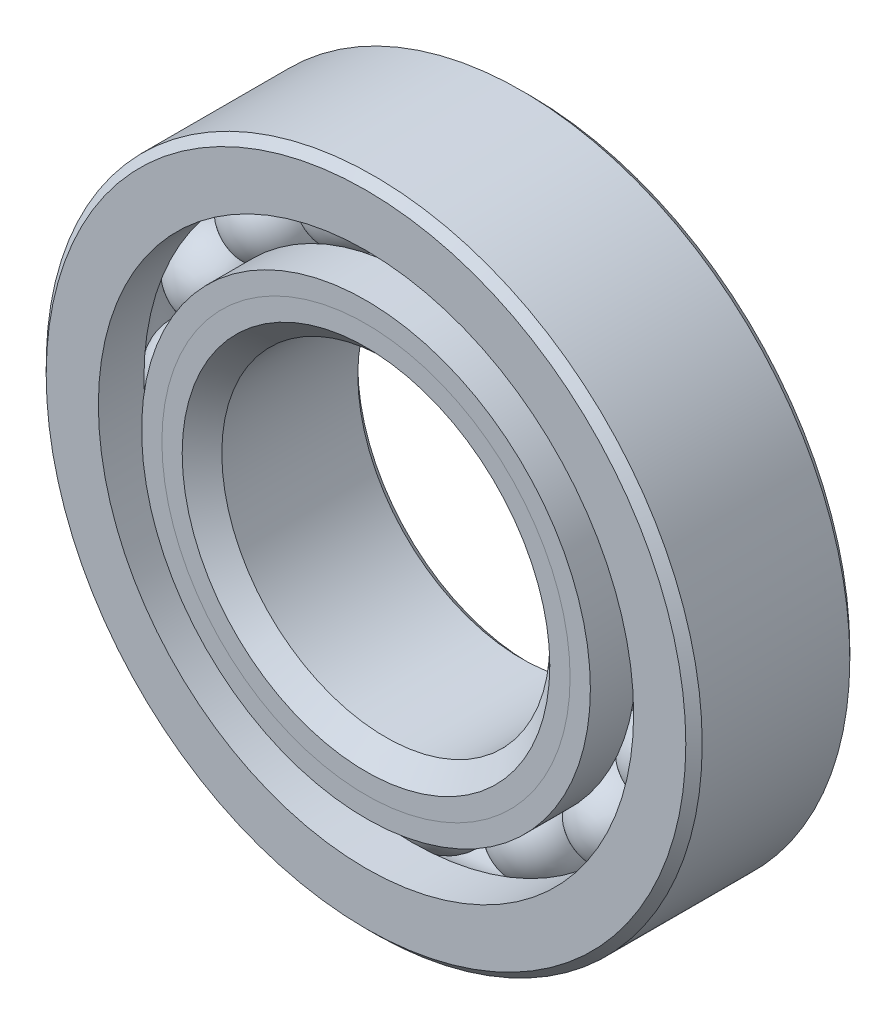
ISO-10303-21;
HEADER;
FILE_DESCRIPTION(('STEP AP214'),'2;1');
FILE_NAME('part.step','',(''),(''),'','','');
FILE_SCHEMA(('AUTOMOTIVE_DESIGN { 1 0 10303 214 1 1 1 1 }'));
ENDSEC;
DATA;
#1=APPLICATION_CONTEXT('core data for automotive mechanical design processes');
#2=APPLICATION_PROTOCOL_DEFINITION('international standard','automotive_design',2000,#1);
#3=PRODUCT_CONTEXT('',#1,'mechanical');
#4=PRODUCT('Part','Part','',(#3));
#5=PRODUCT_RELATED_PRODUCT_CATEGORY('part','',(#4));
#6=PRODUCT_DEFINITION_FORMATION('','',#4);
#7=PRODUCT_DEFINITION_CONTEXT('part definition',#1,'design');
#8=PRODUCT_DEFINITION('design','',#6,#7);
#9=PRODUCT_DEFINITION_SHAPE('','',#8);
#10=(LENGTH_UNIT() NAMED_UNIT(*) SI_UNIT(.MILLI.,.METRE.));
#11=(NAMED_UNIT(*) PLANE_ANGLE_UNIT() SI_UNIT($,.RADIAN.));
#12=(NAMED_UNIT(*) SI_UNIT($,.STERADIAN.) SOLID_ANGLE_UNIT());
#13=UNCERTAINTY_MEASURE_WITH_UNIT(LENGTH_MEASURE(1.E-05),#10,'distance_accuracy_value','');
#14=(GEOMETRIC_REPRESENTATION_CONTEXT(3) GLOBAL_UNCERTAINTY_ASSIGNED_CONTEXT((#13)) GLOBAL_UNIT_ASSIGNED_CONTEXT((#10,
#11,#12)) REPRESENTATION_CONTEXT('',''));
#15=CARTESIAN_POINT('',(0.,0.,0.));
#16=DIRECTION('',(0.,0.,1.));
#17=DIRECTION('',(1.,0.,0.));
#18=AXIS2_PLACEMENT_3D('',#15,#16,#17);
#19=CARTESIAN_POINT('',(-7.29011938655472,17.5999050943401,0.));
#20=DIRECTION('',(0.,0.,1.));
#21=DIRECTION('',(-0.382683432365077,0.923879532511292,0.));
#22=AXIS2_PLACEMENT_3D('',#19,#20,#21);
#23=SPHERICAL_SURFACE('',#22,3.28171342706955);
#24=CARTESIAN_POINT('',(-7.29011938655472,17.5999050943401,3.28171342706955));
#25=VERTEX_POINT('',#24);
#26=VERTEX_LOOP('',#25);
#27=FACE_BOUND('',#26,.T.);
#28=ADVANCED_FACE('F39',(#27),#23,.T.);
#29=CLOSED_SHELL('',(#28));
#30=MANIFOLD_SOLID_BREP('B2',#29);
#31=CARTESIAN_POINT('',(-13.4703841816036,13.4703841816039,0.));
#32=DIRECTION('',(0.,0.,1.));
#33=DIRECTION('',(-0.707106781186539,0.707106781186556,0.));
#34=AXIS2_PLACEMENT_3D('',#31,#32,#33);
#35=SPHERICAL_SURFACE('',#34,3.28171342706955);
#36=CARTESIAN_POINT('',(-13.4703841816036,13.4703841816039,3.28171342706955));
#37=VERTEX_POINT('',#36);
#38=VERTEX_LOOP('',#37);
#39=FACE_BOUND('',#38,.T.);
#40=ADVANCED_FACE('F60',(#39),#35,.T.);
#41=CLOSED_SHELL('',(#40));
#42=MANIFOLD_SOLID_BREP('B6',#41);
#43=CARTESIAN_POINT('',(-17.5999050943399,7.29011938655515,0.));
#44=DIRECTION('',(0.,0.,1.));
#45=DIRECTION('',(-0.923879532511283,0.3826834323651,0.));
#46=AXIS2_PLACEMENT_3D('',#43,#44,#45);
#47=SPHERICAL_SURFACE('',#46,3.28171342706955);
#48=CARTESIAN_POINT('',(-17.5999050943399,7.29011938655515,3.28171342706955));
#49=VERTEX_POINT('',#48);
#50=VERTEX_LOOP('',#49);
#51=FACE_BOUND('',#50,.T.);
#52=ADVANCED_FACE('F81',(#51),#47,.T.);
#53=CLOSED_SHELL('',(#52));
#54=MANIFOLD_SOLID_BREP('B35',#53);
#55=CARTESIAN_POINT('',(-19.05,1.99538274087401E-13,0.));
#56=DIRECTION('',(0.,0.,1.));
#57=DIRECTION('',(-1.,0.,0.));
#58=AXIS2_PLACEMENT_3D('',#55,#56,#57);
#59=SPHERICAL_SURFACE('',#58,3.28171342706955);
#60=CARTESIAN_POINT('',(-19.05,1.99538274087401E-13,3.28171342706955));
#61=VERTEX_POINT('',#60);
#62=VERTEX_LOOP('',#61);
#63=FACE_BOUND('',#62,.T.);
#64=ADVANCED_FACE('F102',(#63),#59,.T.);
#65=CLOSED_SHELL('',(#64));
#66=MANIFOLD_SOLID_BREP('B56',#65);
#67=CARTESIAN_POINT('',(-17.5999050943401,-7.29011938655478,0.));
#68=DIRECTION('',(0.,0.,1.));
#69=DIRECTION('',(-0.923879532511291,-0.382683432365081,0.));
#70=AXIS2_PLACEMENT_3D('',#67,#68,#69);
#71=SPHERICAL_SURFACE('',#70,3.28171342706955);
#72=CARTESIAN_POINT('',(-17.5999050943401,-7.29011938655478,3.28171342706955));
#73=VERTEX_POINT('',#72);
#74=VERTEX_LOOP('',#73);
#75=FACE_BOUND('',#74,.T.);
#76=ADVANCED_FACE('F123',(#75),#71,.T.);
#77=CLOSED_SHELL('',(#76));
#78=MANIFOLD_SOLID_BREP('B77',#77);
#79=CARTESIAN_POINT('',(-13.4703841816038,-13.4703841816036,0.));
#80=DIRECTION('',(0.,0.,1.));
#81=DIRECTION('',(-0.707106781186554,-0.707106781186541,0.));
#82=AXIS2_PLACEMENT_3D('',#79,#80,#81);
#83=SPHERICAL_SURFACE('',#82,3.28171342706955);
#84=CARTESIAN_POINT('',(-13.4703841816038,-13.4703841816036,3.28171342706955));
#85=VERTEX_POINT('',#84);
#86=VERTEX_LOOP('',#85);
#87=FACE_BOUND('',#86,.T.);
#88=ADVANCED_FACE('F144',(#87),#83,.T.);
#89=CLOSED_SHELL('',(#88));
#90=MANIFOLD_SOLID_BREP('B98',#89);
#91=CARTESIAN_POINT('',(-7.2901193865551,-17.59990509434,0.));
#92=DIRECTION('',(0.,0.,1.));
#93=DIRECTION('',(-0.382683432365097,-0.923879532511284,0.));
#94=AXIS2_PLACEMENT_3D('',#91,#92,#93);
#95=SPHERICAL_SURFACE('',#94,3.28171342706955);
#96=CARTESIAN_POINT('',(-7.2901193865551,-17.59990509434,3.28171342706955));
#97=VERTEX_POINT('',#96);
#98=VERTEX_LOOP('',#97);
#99=FACE_BOUND('',#98,.T.);
#100=ADVANCED_FACE('F165',(#99),#95,.T.);
#101=CLOSED_SHELL('',(#100));
#102=MANIFOLD_SOLID_BREP('B119',#101);
#103=CARTESIAN_POINT('',(-1.33025516058267E-13,-19.05,0.));
#104=DIRECTION('',(0.,0.,1.));
#105=DIRECTION('',(0.,-1.,0.));
#106=AXIS2_PLACEMENT_3D('',#103,#104,#105);
#107=SPHERICAL_SURFACE('',#106,3.28171342706955);
#108=CARTESIAN_POINT('',(-1.33025516058267E-13,-19.05,3.28171342706955));
#109=VERTEX_POINT('',#108);
#110=VERTEX_LOOP('',#109);
#111=FACE_BOUND('',#110,.T.);
#112=ADVANCED_FACE('F186',(#111),#107,.T.);
#113=CLOSED_SHELL('',(#112));
#114=MANIFOLD_SOLID_BREP('B140',#113);
#115=CARTESIAN_POINT('',(7.29011938655485,-17.5999050943401,0.));
#116=DIRECTION('',(0.,0.,1.));
#117=DIRECTION('',(0.382683432365084,-0.923879532511289,0.));
#118=AXIS2_PLACEMENT_3D('',#115,#116,#117);
#119=SPHERICAL_SURFACE('',#118,3.28171342706955);
#120=CARTESIAN_POINT('',(7.29011938655485,-17.5999050943401,3.28171342706955));
#121=VERTEX_POINT('',#120);
#122=VERTEX_LOOP('',#121);
#123=FACE_BOUND('',#122,.T.);
#124=ADVANCED_FACE('F207',(#123),#119,.T.);
#125=CLOSED_SHELL('',(#124));
#126=MANIFOLD_SOLID_BREP('B161',#125);
#127=CARTESIAN_POINT('',(13.4703841816037,-13.4703841816038,0.));
#128=DIRECTION('',(0.,0.,1.));
#129=DIRECTION('',(0.707106781186544,-0.707106781186551,0.));
#130=AXIS2_PLACEMENT_3D('',#127,#128,#129);
#131=SPHERICAL_SURFACE('',#130,3.28171342706955);
#132=CARTESIAN_POINT('',(13.4703841816037,-13.4703841816038,3.28171342706955));
#133=VERTEX_POINT('',#132);
#134=VERTEX_LOOP('',#133);
#135=FACE_BOUND('',#134,.T.);
#136=ADVANCED_FACE('F228',(#135),#131,.T.);
#137=CLOSED_SHELL('',(#136));
#138=MANIFOLD_SOLID_BREP('B182',#137);
#139=CARTESIAN_POINT('',(17.59990509434,-7.29011938655504,0.));
#140=DIRECTION('',(0.,0.,1.));
#141=DIRECTION('',(0.923879532511285,-0.382683432365094,0.));
#142=AXIS2_PLACEMENT_3D('',#139,#140,#141);
#143=SPHERICAL_SURFACE('',#142,3.28171342706955);
#144=CARTESIAN_POINT('',(17.59990509434,-7.29011938655504,3.28171342706955));
#145=VERTEX_POINT('',#144);
#146=VERTEX_LOOP('',#145);
#147=FACE_BOUND('',#146,.T.);
#148=ADVANCED_FACE('F249',(#147),#143,.T.);
#149=CLOSED_SHELL('',(#148));
#150=MANIFOLD_SOLID_BREP('B203',#149);
#151=CARTESIAN_POINT('',(19.05,0.,0.));
#152=DIRECTION('',(0.,0.,1.));
#153=DIRECTION('',(1.,0.,0.));
#154=AXIS2_PLACEMENT_3D('',#151,#152,#153);
#155=SPHERICAL_SURFACE('',#154,3.28171342706955);
#156=CARTESIAN_POINT('',(19.05,0.,3.28171342706955));
#157=VERTEX_POINT('',#156);
#158=VERTEX_LOOP('',#157);
#159=FACE_BOUND('',#158,.T.);
#160=ADVANCED_FACE('F270',(#159),#155,.T.);
#161=CLOSED_SHELL('',(#160));
#162=MANIFOLD_SOLID_BREP('B224',#161);
#163=CARTESIAN_POINT('',(17.59990509434,7.29011938655491,0.));
#164=DIRECTION('',(0.,0.,1.));
#165=DIRECTION('',(0.923879532511288,0.382683432365087,0.));
#166=AXIS2_PLACEMENT_3D('',#163,#164,#165);
#167=SPHERICAL_SURFACE('',#166,3.28171342706955);
#168=CARTESIAN_POINT('',(17.59990509434,7.29011938655491,3.28171342706955));
#169=VERTEX_POINT('',#168);
#170=VERTEX_LOOP('',#169);
#171=FACE_BOUND('',#170,.T.);
#172=ADVANCED_FACE('F291',(#171),#167,.T.);
#173=CLOSED_SHELL('',(#172));
#174=MANIFOLD_SOLID_BREP('B245',#173);
#175=CARTESIAN_POINT('',(13.4703841816038,13.4703841816037,0.));
#176=DIRECTION('',(0.,0.,1.));
#177=DIRECTION('',(0.707106781186549,0.707106781186546,0.));
#178=AXIS2_PLACEMENT_3D('',#175,#176,#177);
#179=SPHERICAL_SURFACE('',#178,3.28171342706955);
#180=CARTESIAN_POINT('',(13.4703841816038,13.4703841816037,3.28171342706955));
#181=VERTEX_POINT('',#180);
#182=VERTEX_LOOP('',#181);
#183=FACE_BOUND('',#182,.T.);
#184=ADVANCED_FACE('F312',(#183),#179,.T.);
#185=CLOSED_SHELL('',(#184));
#186=MANIFOLD_SOLID_BREP('B266',#185);
#187=CARTESIAN_POINT('',(7.29011938655498,17.59990509434,0.));
#188=DIRECTION('',(0.,0.,1.));
#189=DIRECTION('',(0.382683432365091,0.923879532511287,0.));
#190=AXIS2_PLACEMENT_3D('',#187,#188,#189);
#191=SPHERICAL_SURFACE('',#190,3.28171342706955);
#192=CARTESIAN_POINT('',(7.29011938655498,17.59990509434,3.28171342706955));
#193=VERTEX_POINT('',#192);
#194=VERTEX_LOOP('',#193);
#195=FACE_BOUND('',#194,.T.);
#196=ADVANCED_FACE('F333',(#195),#191,.T.);
#197=CLOSED_SHELL('',(#196));
#198=MANIFOLD_SOLID_BREP('B287',#197);
#199=CARTESIAN_POINT('',(0.,19.05,0.));
#200=DIRECTION('',(0.,0.,1.));
#201=DIRECTION('',(0.,1.,0.));
#202=AXIS2_PLACEMENT_3D('',#199,#200,#201);
#203=SPHERICAL_SURFACE('',#202,3.28171342706955);
#204=CARTESIAN_POINT('',(0.,19.05,3.28171342706955));
#205=VERTEX_POINT('',#204);
#206=VERTEX_LOOP('',#205);
#207=FACE_BOUND('',#206,.T.);
#208=ADVANCED_FACE('F355',(#207),#203,.T.);
#209=CLOSED_SHELL('',(#208));
#210=MANIFOLD_SOLID_BREP('B308',#209);
#211=CARTESIAN_POINT('',(0.,15.80470900587,6.35));
#212=DIRECTION('',(0.,0.,-1.));
#213=DIRECTION('',(-1.,0.,0.));
#214=AXIS2_PLACEMENT_3D('',#211,#212,#213);
#215=PLANE('',#214);
#216=CARTESIAN_POINT('',(0.,0.,6.35));
#217=DIRECTION('',(0.,0.,1.));
#218=DIRECTION('',(1.,0.,0.));
#219=AXIS2_PLACEMENT_3D('',#216,#217,#218);
#220=CIRCLE('',#219,14.2341432864652);
#221=CARTESIAN_POINT('',(14.2341432864652,0.,6.35));
#222=VERTEX_POINT('',#221);
#223=EDGE_CURVE('E410',#222,#222,#220,.T.);
#224=ORIENTED_EDGE('',*,*,#223,.F.);
#225=EDGE_LOOP('',(#224));
#226=FACE_BOUND('',#225,.T.);
#227=CARTESIAN_POINT('',(0.,0.,6.35));
#228=DIRECTION('',(0.,0.,1.));
#229=DIRECTION('',(1.,0.,0.));
#230=AXIS2_PLACEMENT_3D('',#227,#228,#229);
#231=CIRCLE('',#230,15.80470900587);
#232=CARTESIAN_POINT('',(15.80470900587,0.,6.35));
#233=VERTEX_POINT('',#232);
#234=EDGE_CURVE('E354',#233,#233,#231,.T.);
#235=ORIENTED_EDGE('',*,*,#234,.T.);
#236=EDGE_LOOP('',(#235));
#237=FACE_BOUND('',#236,.T.);
#238=ADVANCED_FACE('F376',(#226,#237),#215,.F.);
#239=CARTESIAN_POINT('',(0.,0.,4.77943428059525));
#240=DIRECTION('',(0.,0.,1.));
#241=DIRECTION('',(1.,0.,0.));
#242=AXIS2_PLACEMENT_3D('',#239,#240,#241);
#243=CONICAL_SURFACE('',#242,14.2341432864652,0.785398163397449);
#244=ORIENTED_EDGE('',*,*,#234,.F.);
#245=EDGE_LOOP('',(#244));
#246=FACE_BOUND('',#245,.T.);
#247=CARTESIAN_POINT('',(0.,0.,4.77943428059525));
#248=DIRECTION('',(0.,0.,1.));
#249=DIRECTION('',(1.,0.,0.));
#250=AXIS2_PLACEMENT_3D('',#247,#248,#249);
#251=CIRCLE('',#250,14.2341432864652);
#252=CARTESIAN_POINT('',(14.2341432864652,0.,4.77943428059525));
#253=VERTEX_POINT('',#252);
#254=EDGE_CURVE('E382',#253,#253,#251,.T.);
#255=ORIENTED_EDGE('',*,*,#254,.T.);
#256=EDGE_LOOP('',(#255));
#257=FACE_BOUND('',#256,.T.);
#258=ADVANCED_FACE('F417',(#246,#257),#243,.T.);
#259=CARTESIAN_POINT('',(0.,0.,6.35));
#260=DIRECTION('',(0.,0.,1.));
#261=DIRECTION('',(1.,0.,0.));
#262=AXIS2_PLACEMENT_3D('',#259,#260,#261);
#263=CYLINDRICAL_SURFACE('',#262,14.2341432864652);
#264=ORIENTED_EDGE('',*,*,#254,.F.);
#265=EDGE_LOOP('',(#264));
#266=FACE_BOUND('',#265,.T.);
#267=CARTESIAN_POINT('',(0.,0.,0.));
#268=DIRECTION('',(0.,0.,1.));
#269=DIRECTION('',(1.,0.,0.));
#270=AXIS2_PLACEMENT_3D('',#267,#268,#269);
#271=CIRCLE('',#270,14.2341432864652);
#272=CARTESIAN_POINT('',(14.2341432864652,0.,0.));
#273=VERTEX_POINT('',#272);
#274=EDGE_CURVE('E386',#273,#273,#271,.T.);
#275=ORIENTED_EDGE('',*,*,#274,.T.);
#276=EDGE_LOOP('',(#275));
#277=FACE_BOUND('',#276,.T.);
#278=ADVANCED_FACE('F421',(#266,#277),#263,.T.);
#279=CARTESIAN_POINT('',(0.,14.2341432864652,0.));
#280=DIRECTION('',(0.,0.,-1.));
#281=DIRECTION('',(-1.,0.,0.));
#282=AXIS2_PLACEMENT_3D('',#279,#280,#281);
#283=PLANE('',#282);
#284=ORIENTED_EDGE('',*,*,#274,.F.);
#285=EDGE_LOOP('',(#284));
#286=FACE_BOUND('',#285,.T.);
#287=CARTESIAN_POINT('',(0.,0.,0.));
#288=DIRECTION('',(0.,0.,1.));
#289=DIRECTION('',(1.,0.,0.));
#290=AXIS2_PLACEMENT_3D('',#287,#288,#289);
#291=CIRCLE('',#290,15.7682865729304);
#292=CARTESIAN_POINT('',(15.7682865729304,0.,0.));
#293=VERTEX_POINT('',#292);
#294=EDGE_CURVE('E390',#293,#293,#291,.T.);
#295=ORIENTED_EDGE('',*,*,#294,.T.);
#296=EDGE_LOOP('',(#295));
#297=FACE_BOUND('',#296,.T.);
#298=ADVANCED_FACE('F426',(#286,#297),#283,.F.);
#299=CARTESIAN_POINT('',(0.,0.,0.));
#300=DIRECTION('',(0.,0.,1.));
#301=DIRECTION('',(1.,0.,0.));
#302=AXIS2_PLACEMENT_3D('',#299,#300,#301);
#303=TOROIDAL_SURFACE('',#302,19.05,3.28171342706955);
#304=ORIENTED_EDGE('',*,*,#294,.F.);
#305=EDGE_LOOP('',(#304));
#306=FACE_BOUND('',#305,.T.);
#307=CARTESIAN_POINT('',(0.,0.,-2.82222222222222));
#308=DIRECTION('',(0.,0.,1.));
#309=DIRECTION('',(1.,0.,0.));
#310=AXIS2_PLACEMENT_3D('',#307,#308,#309);
#311=CIRCLE('',#310,17.3752747252747);
#312=CARTESIAN_POINT('',(17.3752747252747,0.,-2.82222222222222));
#313=VERTEX_POINT('',#312);
#314=EDGE_CURVE('E395',#313,#313,#311,.T.);
#315=ORIENTED_EDGE('',*,*,#314,.T.);
#316=EDGE_LOOP('',(#315));
#317=FACE_BOUND('',#316,.T.);
#318=ADVANCED_FACE('F432',(#306,#317),#303,.F.);
#319=CARTESIAN_POINT('',(0.,0.,6.35));
#320=DIRECTION('',(0.,0.,1.));
#321=DIRECTION('',(1.,0.,0.));
#322=AXIS2_PLACEMENT_3D('',#319,#320,#321);
#323=CYLINDRICAL_SURFACE('',#322,17.3752747252747);
#324=ORIENTED_EDGE('',*,*,#314,.F.);
#325=EDGE_LOOP('',(#324));
#326=FACE_BOUND('',#325,.T.);
#327=CARTESIAN_POINT('',(0.,0.,-6.35));
#328=DIRECTION('',(0.,0.,1.));
#329=DIRECTION('',(1.,0.,0.));
#330=AXIS2_PLACEMENT_3D('',#327,#328,#329);
#331=CIRCLE('',#330,17.3752747252747);
#332=CARTESIAN_POINT('',(17.3752747252747,0.,-6.35));
#333=VERTEX_POINT('',#332);
#334=EDGE_CURVE('E398',#333,#333,#331,.T.);
#335=ORIENTED_EDGE('',*,*,#334,.T.);
#336=EDGE_LOOP('',(#335));
#337=FACE_BOUND('',#336,.T.);
#338=ADVANCED_FACE('F436',(#326,#337),#323,.T.);
#339=CARTESIAN_POINT('',(0.,13.335,-6.35));
#340=DIRECTION('',(0.,0.,1.));
#341=DIRECTION('',(1.,0.,0.));
#342=AXIS2_PLACEMENT_3D('',#339,#340,#341);
#343=PLANE('',#342);
#344=ORIENTED_EDGE('',*,*,#334,.F.);
#345=EDGE_LOOP('',(#344));
#346=FACE_BOUND('',#345,.T.);
#347=CARTESIAN_POINT('',(0.,0.,-6.35));
#348=DIRECTION('',(0.,0.,1.));
#349=DIRECTION('',(1.,0.,0.));
#350=AXIS2_PLACEMENT_3D('',#347,#348,#349);
#351=CIRCLE('',#350,13.335);
#352=CARTESIAN_POINT('',(13.335,0.,-6.35));
#353=VERTEX_POINT('',#352);
#354=EDGE_CURVE('E401',#353,#353,#351,.T.);
#355=ORIENTED_EDGE('',*,*,#354,.T.);
#356=EDGE_LOOP('',(#355));
#357=FACE_BOUND('',#356,.T.);
#358=ADVANCED_FACE('F440',(#346,#357),#343,.F.);
#359=CARTESIAN_POINT('',(0.,0.,-5.715));
#360=DIRECTION('',(0.,0.,-1.));
#361=DIRECTION('',(-1.,0.,0.));
#362=AXIS2_PLACEMENT_3D('',#359,#360,#361);
#363=CONICAL_SURFACE('',#362,12.7,0.785398163397446);
#364=ORIENTED_EDGE('',*,*,#354,.F.);
#365=EDGE_LOOP('',(#364));
#366=FACE_BOUND('',#365,.T.);
#367=CARTESIAN_POINT('',(0.,0.,-5.715));
#368=DIRECTION('',(0.,0.,1.));
#369=DIRECTION('',(1.,0.,0.));
#370=AXIS2_PLACEMENT_3D('',#367,#368,#369);
#371=CIRCLE('',#370,12.7);
#372=CARTESIAN_POINT('',(12.7,0.,-5.715));
#373=VERTEX_POINT('',#372);
#374=EDGE_CURVE('E404',#373,#373,#371,.T.);
#375=ORIENTED_EDGE('',*,*,#374,.T.);
#376=EDGE_LOOP('',(#375));
#377=FACE_BOUND('',#376,.T.);
#378=ADVANCED_FACE('F444',(#366,#377),#363,.F.);
#379=CARTESIAN_POINT('',(0.,0.,6.35));
#380=DIRECTION('',(0.,0.,1.));
#381=DIRECTION('',(1.,0.,0.));
#382=AXIS2_PLACEMENT_3D('',#379,#380,#381);
#383=CYLINDRICAL_SURFACE('',#382,12.7);
#384=ORIENTED_EDGE('',*,*,#374,.F.);
#385=EDGE_LOOP('',(#384));
#386=FACE_BOUND('',#385,.T.);
#387=CARTESIAN_POINT('',(0.,0.,4.81585671353478));
#388=DIRECTION('',(0.,0.,1.));
#389=DIRECTION('',(1.,0.,0.));
#390=AXIS2_PLACEMENT_3D('',#387,#388,#389);
#391=CIRCLE('',#390,12.7);
#392=CARTESIAN_POINT('',(12.7,0.,4.81585671353478));
#393=VERTEX_POINT('',#392);
#394=EDGE_CURVE('E407',#393,#393,#391,.T.);
#395=ORIENTED_EDGE('',*,*,#394,.T.);
#396=EDGE_LOOP('',(#395));
#397=FACE_BOUND('',#396,.T.);
#398=ADVANCED_FACE('F448',(#386,#397),#383,.F.);
#399=CARTESIAN_POINT('',(0.,0.,6.35));
#400=DIRECTION('',(0.,0.,1.));
#401=DIRECTION('',(1.,0.,0.));
#402=AXIS2_PLACEMENT_3D('',#399,#400,#401);
#403=CONICAL_SURFACE('',#402,14.2341432864652,0.785398163397449);
#404=ORIENTED_EDGE('',*,*,#394,.F.);
#405=EDGE_LOOP('',(#404));
#406=FACE_BOUND('',#405,.T.);
#407=ORIENTED_EDGE('',*,*,#223,.T.);
#408=EDGE_LOOP('',(#407));
#409=FACE_BOUND('',#408,.T.);
#410=ADVANCED_FACE('F414',(#406,#409),#403,.F.);
#411=CLOSED_SHELL('',(#238,#258,#278,#298,#318,#338,#358,#378,#398,#410));
#412=MANIFOLD_SOLID_BREP('B329',#411);
#413=CARTESIAN_POINT('',(0.,17.3752747252747,6.35));
#414=DIRECTION('',(0.,0.,-1.));
#415=DIRECTION('',(-1.,0.,0.));
#416=AXIS2_PLACEMENT_3D('',#413,#414,#415);
#417=PLANE('',#416);
#418=CARTESIAN_POINT('',(0.,0.,6.35));
#419=DIRECTION('',(0.,0.,1.));
#420=DIRECTION('',(1.,0.,0.));
#421=AXIS2_PLACEMENT_3D('',#418,#419,#420);
#422=CIRCLE('',#421,15.80470900587);
#423=CARTESIAN_POINT('',(15.80470900587,0.,6.35));
#424=VERTEX_POINT('',#423);
#425=EDGE_CURVE('E375',#424,#424,#422,.T.);
#426=ORIENTED_EDGE('',*,*,#425,.F.);
#427=EDGE_LOOP('',(#426));
#428=FACE_BOUND('',#427,.T.);
#429=CARTESIAN_POINT('',(0.,0.,6.35));
#430=DIRECTION('',(0.,0.,1.));
#431=DIRECTION('',(1.,0.,0.));
#432=AXIS2_PLACEMENT_3D('',#429,#430,#431);
#433=CIRCLE('',#432,17.3752747252747);
#434=CARTESIAN_POINT('',(17.3752747252747,0.,6.35));
#435=VERTEX_POINT('',#434);
#436=EDGE_CURVE('E557',#435,#435,#433,.T.);
#437=ORIENTED_EDGE('',*,*,#436,.T.);
#438=EDGE_LOOP('',(#437));
#439=FACE_BOUND('',#438,.T.);
#440=ADVANCED_FACE('F535',(#428,#439),#417,.F.);
#441=CARTESIAN_POINT('',(0.,0.,6.35));
#442=DIRECTION('',(0.,0.,1.));
#443=DIRECTION('',(1.,0.,0.));
#444=AXIS2_PLACEMENT_3D('',#441,#442,#443);
#445=CONICAL_SURFACE('',#444,15.80470900587,0.785398163397449);
#446=CARTESIAN_POINT('',(0.,0.,4.77943428059525));
#447=DIRECTION('',(0.,0.,1.));
#448=DIRECTION('',(1.,0.,0.));
#449=AXIS2_PLACEMENT_3D('',#446,#447,#448);
#450=CIRCLE('',#449,14.2341432864652);
#451=CARTESIAN_POINT('',(14.2341432864652,0.,4.77943428059525));
#452=VERTEX_POINT('',#451);
#453=EDGE_CURVE('E541',#452,#452,#450,.T.);
#454=ORIENTED_EDGE('',*,*,#453,.F.);
#455=EDGE_LOOP('',(#454));
#456=FACE_BOUND('',#455,.T.);
#457=ORIENTED_EDGE('',*,*,#425,.T.);
#458=EDGE_LOOP('',(#457));
#459=FACE_BOUND('',#458,.T.);
#460=ADVANCED_FACE('F582',(#456,#459),#445,.F.);
#461=CARTESIAN_POINT('',(0.,0.,6.35));
#462=DIRECTION('',(0.,0.,1.));
#463=DIRECTION('',(1.,0.,0.));
#464=AXIS2_PLACEMENT_3D('',#461,#462,#463);
#465=CYLINDRICAL_SURFACE('',#464,14.2341432864652);
#466=CARTESIAN_POINT('',(0.,0.,0.));
#467=DIRECTION('',(0.,0.,1.));
#468=DIRECTION('',(1.,0.,0.));
#469=AXIS2_PLACEMENT_3D('',#466,#467,#468);
#470=CIRCLE('',#469,14.2341432864652);
#471=CARTESIAN_POINT('',(14.2341432864652,0.,0.));
#472=VERTEX_POINT('',#471);
#473=EDGE_CURVE('E545',#472,#472,#470,.T.);
#474=ORIENTED_EDGE('',*,*,#473,.F.);
#475=EDGE_LOOP('',(#474));
#476=FACE_BOUND('',#475,.T.);
#477=ORIENTED_EDGE('',*,*,#453,.T.);
#478=EDGE_LOOP('',(#477));
#479=FACE_BOUND('',#478,.T.);
#480=ADVANCED_FACE('F577',(#476,#479),#465,.F.);
#481=CARTESIAN_POINT('',(0.,14.2341432864652,0.));
#482=DIRECTION('',(0.,0.,1.));
#483=DIRECTION('',(1.,0.,0.));
#484=AXIS2_PLACEMENT_3D('',#481,#482,#483);
#485=PLANE('',#484);
#486=CARTESIAN_POINT('',(0.,0.,0.));
#487=DIRECTION('',(0.,0.,1.));
#488=DIRECTION('',(1.,0.,0.));
#489=AXIS2_PLACEMENT_3D('',#486,#487,#488);
#490=CIRCLE('',#489,15.7682865729304);
#491=CARTESIAN_POINT('',(15.7682865729304,0.,0.));
#492=VERTEX_POINT('',#491);
#493=EDGE_CURVE('E549',#492,#492,#490,.T.);
#494=ORIENTED_EDGE('',*,*,#493,.F.);
#495=EDGE_LOOP('',(#494));
#496=FACE_BOUND('',#495,.T.);
#497=ORIENTED_EDGE('',*,*,#473,.T.);
#498=EDGE_LOOP('',(#497));
#499=FACE_BOUND('',#498,.T.);
#500=ADVANCED_FACE('F571',(#496,#499),#485,.F.);
#501=CARTESIAN_POINT('',(0.,0.,0.));
#502=DIRECTION('',(0.,0.,1.));
#503=DIRECTION('',(1.,0.,0.));
#504=AXIS2_PLACEMENT_3D('',#501,#502,#503);
#505=TOROIDAL_SURFACE('',#504,19.05,3.28171342706955);
#506=CARTESIAN_POINT('',(0.,0.,2.82222222222222));
#507=DIRECTION('',(0.,0.,1.));
#508=DIRECTION('',(1.,0.,0.));
#509=AXIS2_PLACEMENT_3D('',#506,#507,#508);
#510=CIRCLE('',#509,17.3752747252747);
#511=CARTESIAN_POINT('',(17.3752747252747,0.,2.82222222222222));
#512=VERTEX_POINT('',#511);
#513=EDGE_CURVE('E554',#512,#512,#510,.T.);
#514=ORIENTED_EDGE('',*,*,#513,.F.);
#515=EDGE_LOOP('',(#514));
#516=FACE_BOUND('',#515,.T.);
#517=ORIENTED_EDGE('',*,*,#493,.T.);
#518=EDGE_LOOP('',(#517));
#519=FACE_BOUND('',#518,.T.);
#520=ADVANCED_FACE('F565',(#516,#519),#505,.F.);
#521=CARTESIAN_POINT('',(0.,0.,6.35));
#522=DIRECTION('',(0.,0.,1.));
#523=DIRECTION('',(1.,0.,0.));
#524=AXIS2_PLACEMENT_3D('',#521,#522,#523);
#525=CYLINDRICAL_SURFACE('',#524,17.3752747252747);
#526=ORIENTED_EDGE('',*,*,#436,.F.);
#527=EDGE_LOOP('',(#526));
#528=FACE_BOUND('',#527,.T.);
#529=ORIENTED_EDGE('',*,*,#513,.T.);
#530=EDGE_LOOP('',(#529));
#531=FACE_BOUND('',#530,.T.);
#532=ADVANCED_FACE('F562',(#528,#531),#525,.T.);
#533=CLOSED_SHELL('',(#440,#460,#480,#500,#520,#532));
#534=MANIFOLD_SOLID_BREP('B349',#533);
#535=CARTESIAN_POINT('',(0.,0.,5.715));
#536=DIRECTION('',(0.,0.,-1.));
#537=DIRECTION('',(-1.,0.,0.));
#538=AXIS2_PLACEMENT_3D('',#535,#536,#537);
#539=CONICAL_SURFACE('',#538,25.4,0.785398163397443);
#540=CARTESIAN_POINT('',(0.,0.,6.35));
#541=DIRECTION('',(0.,0.,1.));
#542=DIRECTION('',(1.,0.,0.));
#543=AXIS2_PLACEMENT_3D('',#540,#541,#542);
#544=CIRCLE('',#543,24.765);
#545=CARTESIAN_POINT('',(24.765,0.,6.35));
#546=VERTEX_POINT('',#545);
#547=EDGE_CURVE('E655',#546,#546,#544,.T.);
#548=ORIENTED_EDGE('',*,*,#547,.F.);
#549=EDGE_LOOP('',(#548));
#550=FACE_BOUND('',#549,.T.);
#551=CARTESIAN_POINT('',(0.,0.,5.715));
#552=DIRECTION('',(0.,0.,1.));
#553=DIRECTION('',(1.,0.,0.));
#554=AXIS2_PLACEMENT_3D('',#551,#552,#553);
#555=CIRCLE('',#554,25.4);
#556=CARTESIAN_POINT('',(25.4,0.,5.715));
#557=VERTEX_POINT('',#556);
#558=EDGE_CURVE('E534',#557,#557,#555,.T.);
#559=ORIENTED_EDGE('',*,*,#558,.T.);
#560=EDGE_LOOP('',(#559));
#561=FACE_BOUND('',#560,.T.);
#562=ADVANCED_FACE('F627',(#550,#561),#539,.T.);
#563=CARTESIAN_POINT('',(0.,0.,6.35));
#564=DIRECTION('',(0.,0.,1.));
#565=DIRECTION('',(1.,0.,0.));
#566=AXIS2_PLACEMENT_3D('',#563,#564,#565);
#567=CYLINDRICAL_SURFACE('',#566,25.4);
#568=ORIENTED_EDGE('',*,*,#558,.F.);
#569=EDGE_LOOP('',(#568));
#570=FACE_BOUND('',#569,.T.);
#571=CARTESIAN_POINT('',(0.,0.,-5.715));
#572=DIRECTION('',(0.,0.,1.));
#573=DIRECTION('',(1.,0.,0.));
#574=AXIS2_PLACEMENT_3D('',#571,#572,#573);
#575=CIRCLE('',#574,25.4);
#576=CARTESIAN_POINT('',(25.4,0.,-5.715));
#577=VERTEX_POINT('',#576);
#578=EDGE_CURVE('E633',#577,#577,#575,.T.);
#579=ORIENTED_EDGE('',*,*,#578,.T.);
#580=EDGE_LOOP('',(#579));
#581=FACE_BOUND('',#580,.T.);
#582=ADVANCED_FACE('F662',(#570,#581),#567,.T.);
#583=CARTESIAN_POINT('',(0.,0.,-6.35));
#584=DIRECTION('',(0.,0.,1.));
#585=DIRECTION('',(1.,0.,0.));
#586=AXIS2_PLACEMENT_3D('',#583,#584,#585);
#587=CONICAL_SURFACE('',#586,24.765,0.785398163397443);
#588=ORIENTED_EDGE('',*,*,#578,.F.);
#589=EDGE_LOOP('',(#588));
#590=FACE_BOUND('',#589,.T.);
#591=CARTESIAN_POINT('',(0.,0.,-6.35));
#592=DIRECTION('',(0.,0.,1.));
#593=DIRECTION('',(1.,0.,0.));
#594=AXIS2_PLACEMENT_3D('',#591,#592,#593);
#595=CIRCLE('',#594,24.765);
#596=CARTESIAN_POINT('',(24.765,0.,-6.35));
#597=VERTEX_POINT('',#596);
#598=EDGE_CURVE('E637',#597,#597,#595,.T.);
#599=ORIENTED_EDGE('',*,*,#598,.T.);
#600=EDGE_LOOP('',(#599));
#601=FACE_BOUND('',#600,.T.);
#602=ADVANCED_FACE('F666',(#590,#601),#587,.T.);
#603=CARTESIAN_POINT('',(0.,24.765,-6.35));
#604=DIRECTION('',(0.,0.,1.));
#605=DIRECTION('',(1.,0.,0.));
#606=AXIS2_PLACEMENT_3D('',#603,#604,#605);
#607=PLANE('',#606);
#608=ORIENTED_EDGE('',*,*,#598,.F.);
#609=EDGE_LOOP('',(#608));
#610=FACE_BOUND('',#609,.T.);
#611=CARTESIAN_POINT('',(0.,0.,-6.35));
#612=DIRECTION('',(0.,0.,1.));
#613=DIRECTION('',(1.,0.,0.));
#614=AXIS2_PLACEMENT_3D('',#611,#612,#613);
#615=CIRCLE('',#614,20.7247252747253);
#616=CARTESIAN_POINT('',(20.7247252747253,0.,-6.35));
#617=VERTEX_POINT('',#616);
#618=EDGE_CURVE('E641',#617,#617,#615,.T.);
#619=ORIENTED_EDGE('',*,*,#618,.T.);
#620=EDGE_LOOP('',(#619));
#621=FACE_BOUND('',#620,.T.);
#622=ADVANCED_FACE('F671',(#610,#621),#607,.F.);
#623=CARTESIAN_POINT('',(0.,0.,6.35));
#624=DIRECTION('',(0.,0.,1.));
#625=DIRECTION('',(1.,0.,0.));
#626=AXIS2_PLACEMENT_3D('',#623,#624,#625);
#627=CYLINDRICAL_SURFACE('',#626,20.7247252747253);
#628=ORIENTED_EDGE('',*,*,#618,.F.);
#629=EDGE_LOOP('',(#628));
#630=FACE_BOUND('',#629,.T.);
#631=CARTESIAN_POINT('',(0.,0.,-2.82222222222222));
#632=DIRECTION('',(0.,0.,1.));
#633=DIRECTION('',(1.,0.,0.));
#634=AXIS2_PLACEMENT_3D('',#631,#632,#633);
#635=CIRCLE('',#634,20.7247252747253);
#636=CARTESIAN_POINT('',(20.7247252747253,0.,-2.82222222222222));
#637=VERTEX_POINT('',#636);
#638=EDGE_CURVE('E646',#637,#637,#635,.T.);
#639=ORIENTED_EDGE('',*,*,#638,.T.);
#640=EDGE_LOOP('',(#639));
#641=FACE_BOUND('',#640,.T.);
#642=ADVANCED_FACE('F677',(#630,#641),#627,.F.);
#643=CARTESIAN_POINT('',(0.,0.,0.));
#644=DIRECTION('',(0.,0.,1.));
#645=DIRECTION('',(1.,0.,0.));
#646=AXIS2_PLACEMENT_3D('',#643,#644,#645);
#647=TOROIDAL_SURFACE('',#646,19.05,3.28171342706955);
#648=ORIENTED_EDGE('',*,*,#638,.F.);
#649=EDGE_LOOP('',(#648));
#650=FACE_BOUND('',#649,.T.);
#651=CARTESIAN_POINT('',(0.,0.,2.82222222222222));
#652=DIRECTION('',(0.,0.,1.));
#653=DIRECTION('',(1.,0.,0.));
#654=AXIS2_PLACEMENT_3D('',#651,#652,#653);
#655=CIRCLE('',#654,20.7247252747253);
#656=CARTESIAN_POINT('',(20.7247252747253,0.,2.82222222222222));
#657=VERTEX_POINT('',#656);
#658=EDGE_CURVE('E649',#657,#657,#655,.T.);
#659=ORIENTED_EDGE('',*,*,#658,.T.);
#660=EDGE_LOOP('',(#659));
#661=FACE_BOUND('',#660,.T.);
#662=ADVANCED_FACE('F681',(#650,#661),#647,.F.);
#663=CARTESIAN_POINT('',(0.,0.,6.35));
#664=DIRECTION('',(0.,0.,1.));
#665=DIRECTION('',(1.,0.,0.));
#666=AXIS2_PLACEMENT_3D('',#663,#664,#665);
#667=CYLINDRICAL_SURFACE('',#666,20.7247252747253);
#668=ORIENTED_EDGE('',*,*,#658,.F.);
#669=EDGE_LOOP('',(#668));
#670=FACE_BOUND('',#669,.T.);
#671=CARTESIAN_POINT('',(0.,0.,6.35));
#672=DIRECTION('',(0.,0.,1.));
#673=DIRECTION('',(1.,0.,0.));
#674=AXIS2_PLACEMENT_3D('',#671,#672,#673);
#675=CIRCLE('',#674,20.7247252747253);
#676=CARTESIAN_POINT('',(20.7247252747253,0.,6.35));
#677=VERTEX_POINT('',#676);
#678=EDGE_CURVE('E652',#677,#677,#675,.T.);
#679=ORIENTED_EDGE('',*,*,#678,.T.);
#680=EDGE_LOOP('',(#679));
#681=FACE_BOUND('',#680,.T.);
#682=ADVANCED_FACE('F685',(#670,#681),#667,.F.);
#683=CARTESIAN_POINT('',(0.,24.765,6.35));
#684=DIRECTION('',(0.,0.,-1.));
#685=DIRECTION('',(-1.,0.,0.));
#686=AXIS2_PLACEMENT_3D('',#683,#684,#685);
#687=PLANE('',#686);
#688=ORIENTED_EDGE('',*,*,#678,.F.);
#689=EDGE_LOOP('',(#688));
#690=FACE_BOUND('',#689,.T.);
#691=ORIENTED_EDGE('',*,*,#547,.T.);
#692=EDGE_LOOP('',(#691));
#693=FACE_BOUND('',#692,.T.);
#694=ADVANCED_FACE('F659',(#690,#693),#687,.F.);
#695=CLOSED_SHELL('',(#562,#582,#602,#622,#642,#662,#682,#694));
#696=MANIFOLD_SOLID_BREP('B370',#695);
#697=ADVANCED_BREP_SHAPE_REPRESENTATION('',(#18,#30,#42,#54,#66,#78,#90,#102,#114,#126,#138,
#150,#162,#174,#186,#198,#210,#412,#534,#696),#14);
#698=SHAPE_DEFINITION_REPRESENTATION(#9,#697);
ENDSEC;
END-ISO-10303-21;
